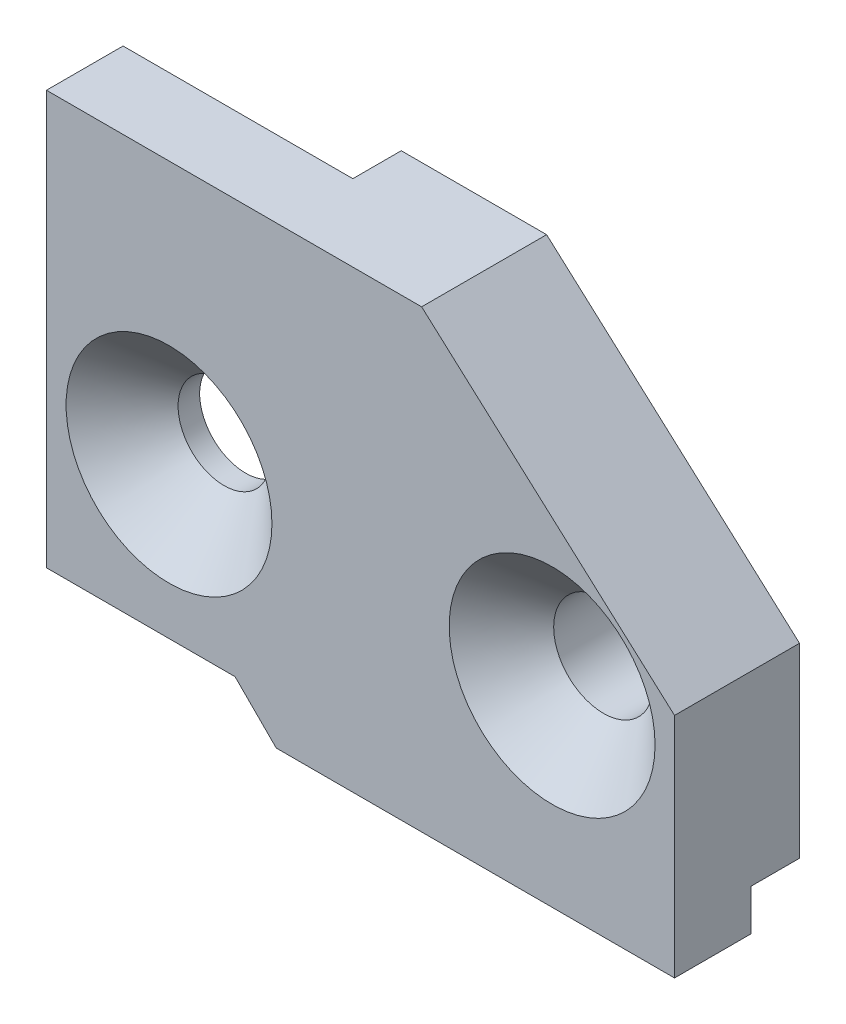
ISO-10303-21;
HEADER;
FILE_DESCRIPTION(('STEP AP214'),'2;1');
FILE_NAME('part.step','',(''),(''),'','','');
FILE_SCHEMA(('AUTOMOTIVE_DESIGN { 1 0 10303 214 1 1 1 1 }'));
ENDSEC;
DATA;
#1=APPLICATION_CONTEXT('core data for automotive mechanical design processes');
#2=APPLICATION_PROTOCOL_DEFINITION('international standard','automotive_design',2000,#1);
#3=PRODUCT_CONTEXT('',#1,'mechanical');
#4=PRODUCT('Part','Part','',(#3));
#5=PRODUCT_RELATED_PRODUCT_CATEGORY('part','',(#4));
#6=PRODUCT_DEFINITION_FORMATION('','',#4);
#7=PRODUCT_DEFINITION_CONTEXT('part definition',#1,'design');
#8=PRODUCT_DEFINITION('design','',#6,#7);
#9=PRODUCT_DEFINITION_SHAPE('','',#8);
#10=(LENGTH_UNIT() NAMED_UNIT(*) SI_UNIT(.MILLI.,.METRE.));
#11=(NAMED_UNIT(*) PLANE_ANGLE_UNIT() SI_UNIT($,.RADIAN.));
#12=(NAMED_UNIT(*) SI_UNIT($,.STERADIAN.) SOLID_ANGLE_UNIT());
#13=UNCERTAINTY_MEASURE_WITH_UNIT(LENGTH_MEASURE(1.E-05),#10,'distance_accuracy_value','');
#14=(GEOMETRIC_REPRESENTATION_CONTEXT(3) GLOBAL_UNCERTAINTY_ASSIGNED_CONTEXT((#13)) GLOBAL_UNIT_ASSIGNED_CONTEXT((#10,
#11,#12)) REPRESENTATION_CONTEXT('',''));
#15=CARTESIAN_POINT('',(0.,0.,0.));
#16=DIRECTION('',(0.,0.,1.));
#17=DIRECTION('',(1.,0.,0.));
#18=AXIS2_PLACEMENT_3D('',#15,#16,#17);
#19=CARTESIAN_POINT('',(0.,0.,0.));
#20=DIRECTION('',(0.,0.,1.));
#21=DIRECTION('',(1.,0.,0.));
#22=AXIS2_PLACEMENT_3D('',#19,#20,#21);
#23=PLANE('',#22);
#24=CARTESIAN_POINT('',(-92.232371,-75.223646,0.));
#25=DIRECTION('',(0.,0.,1.));
#26=DIRECTION('',(1.,0.,0.));
#27=AXIS2_PLACEMENT_3D('',#24,#25,#26);
#28=CIRCLE('',#27,1.5);
#29=CARTESIAN_POINT('',(-90.732371,-75.223646,0.));
#30=VERTEX_POINT('',#29);
#31=EDGE_CURVE('E158',#30,#30,#28,.T.);
#32=ORIENTED_EDGE('',*,*,#31,.T.);
#33=EDGE_LOOP('',(#32));
#34=FACE_BOUND('',#33,.T.);
#35=DIRECTION('',(0.,1.,0.));
#36=VECTOR('',#35,1.);
#37=CARTESIAN_POINT('',(-88.732371,-80.148646,0.));
#38=LINE('',#37,#36);
#39=CARTESIAN_POINT('',(-88.732371,-80.148646,0.));
#40=VERTEX_POINT('',#39);
#41=CARTESIAN_POINT('',(-88.732371,-66.648646,0.));
#42=VERTEX_POINT('',#41);
#43=EDGE_CURVE('E139',#40,#42,#38,.T.);
#44=ORIENTED_EDGE('',*,*,#43,.F.);
#45=DIRECTION('',(-1.,0.,0.));
#46=VECTOR('',#45,1.);
#47=CARTESIAN_POINT('',(-75.732371,-80.148646,0.));
#48=LINE('',#47,#46);
#49=CARTESIAN_POINT('',(-75.732371,-80.148646,0.));
#50=VERTEX_POINT('',#49);
#51=EDGE_CURVE('E50',#50,#40,#48,.T.);
#52=ORIENTED_EDGE('',*,*,#51,.F.);
#53=DIRECTION('',(0.,1.,0.));
#54=VECTOR('',#53,1.);
#55=CARTESIAN_POINT('',(-75.732371,-81.493646,0.));
#56=LINE('',#55,#54);
#57=CARTESIAN_POINT('',(-75.732371,-81.493646,0.));
#58=VERTEX_POINT('',#57);
#59=EDGE_CURVE('E185',#58,#50,#56,.T.);
#60=ORIENTED_EDGE('',*,*,#59,.F.);
#61=DIRECTION('',(1.,0.,0.));
#62=VECTOR('',#61,1.);
#63=CARTESIAN_POINT('',(-75.732371,-81.493646,0.));
#64=LINE('',#63,#62);
#65=CARTESIAN_POINT('',(-88.732371,-81.493646,0.));
#66=VERTEX_POINT('',#65);
#67=EDGE_CURVE('E183',#66,#58,#64,.T.);
#68=ORIENTED_EDGE('',*,*,#67,.F.);
#69=DIRECTION('',(0.707106781186551,-0.707106781186544,0.));
#70=VECTOR('',#69,1.);
#71=CARTESIAN_POINT('',(-90.077371,-80.148646,0.));
#72=LINE('',#71,#70);
#73=CARTESIAN_POINT('',(-90.077371,-80.148646,0.));
#74=VERTEX_POINT('',#73);
#75=EDGE_CURVE('E181',#74,#66,#72,.T.);
#76=ORIENTED_EDGE('',*,*,#75,.F.);
#77=DIRECTION('',(1.,0.,0.));
#78=VECTOR('',#77,1.);
#79=CARTESIAN_POINT('',(-96.232371,-80.148646,0.));
#80=LINE('',#79,#78);
#81=CARTESIAN_POINT('',(-96.232371,-80.148646,0.));
#82=VERTEX_POINT('',#81);
#83=EDGE_CURVE('E179',#82,#74,#80,.T.);
#84=ORIENTED_EDGE('',*,*,#83,.F.);
#85=DIRECTION('',(0.,-1.,0.));
#86=VECTOR('',#85,1.);
#87=CARTESIAN_POINT('',(-96.232371,-66.648646,0.));
#88=LINE('',#87,#86);
#89=CARTESIAN_POINT('',(-96.232371,-66.648646,0.));
#90=VERTEX_POINT('',#89);
#91=EDGE_CURVE('E161',#90,#82,#88,.T.);
#92=ORIENTED_EDGE('',*,*,#91,.F.);
#93=DIRECTION('',(-1.,0.,0.));
#94=VECTOR('',#93,1.);
#95=CARTESIAN_POINT('',(-96.232371,-66.648646,0.));
#96=LINE('',#95,#94);
#97=EDGE_CURVE('E56',#42,#90,#96,.T.);
#98=ORIENTED_EDGE('',*,*,#97,.F.);
#99=EDGE_LOOP('',(#44,#52,#60,#68,#76,#84,#92,#98));
#100=FACE_BOUND('',#99,.T.);
#101=ADVANCED_FACE('F33',(#34,#100),#23,.F.);
#102=CARTESIAN_POINT('',(0.,0.,2.5));
#103=DIRECTION('',(0.,0.,1.));
#104=DIRECTION('',(1.,0.,0.));
#105=AXIS2_PLACEMENT_3D('',#102,#103,#104);
#106=PLANE('',#105);
#107=CARTESIAN_POINT('',(-92.232371,-75.223646,2.5));
#108=DIRECTION('',(0.,0.,1.));
#109=DIRECTION('',(1.,0.,0.));
#110=AXIS2_PLACEMENT_3D('',#107,#108,#109);
#111=CIRCLE('',#110,3.35997123);
#112=CARTESIAN_POINT('',(-88.87239977,-75.223646,2.5));
#113=VERTEX_POINT('',#112);
#114=EDGE_CURVE('E199',#113,#113,#111,.T.);
#115=ORIENTED_EDGE('',*,*,#114,.F.);
#116=EDGE_LOOP('',(#115));
#117=FACE_BOUND('',#116,.T.);
#118=CARTESIAN_POINT('',(-79.72767153,-75.223646,2.5));
#119=DIRECTION('',(0.,0.,1.));
#120=DIRECTION('',(1.,0.,0.));
#121=AXIS2_PLACEMENT_3D('',#118,#119,#120);
#122=CIRCLE('',#121,3.35997123);
#123=CARTESIAN_POINT('',(-76.3677003,-75.223646,2.5));
#124=VERTEX_POINT('',#123);
#125=EDGE_CURVE('E204',#124,#124,#122,.T.);
#126=ORIENTED_EDGE('',*,*,#125,.F.);
#127=EDGE_LOOP('',(#126));
#128=FACE_BOUND('',#127,.T.);
#129=DIRECTION('',(0.,-1.,0.));
#130=VECTOR('',#129,1.);
#131=CARTESIAN_POINT('',(-96.232371,-66.648646,2.5));
#132=LINE('',#131,#130);
#133=CARTESIAN_POINT('',(-96.232371,-66.648646,2.5));
#134=VERTEX_POINT('',#133);
#135=CARTESIAN_POINT('',(-96.232371,-80.148646,2.5));
#136=VERTEX_POINT('',#135);
#137=EDGE_CURVE('E162',#134,#136,#132,.T.);
#138=ORIENTED_EDGE('',*,*,#137,.T.);
#139=DIRECTION('',(1.,0.,0.));
#140=VECTOR('',#139,1.);
#141=CARTESIAN_POINT('',(-96.232371,-80.148646,2.5));
#142=LINE('',#141,#140);
#143=CARTESIAN_POINT('',(-90.077371,-80.148646,2.5));
#144=VERTEX_POINT('',#143);
#145=EDGE_CURVE('E165',#136,#144,#142,.T.);
#146=ORIENTED_EDGE('',*,*,#145,.T.);
#147=DIRECTION('',(0.707106781186551,-0.707106781186544,0.));
#148=VECTOR('',#147,1.);
#149=CARTESIAN_POINT('',(-90.077371,-80.148646,2.5));
#150=LINE('',#149,#148);
#151=CARTESIAN_POINT('',(-88.732371,-81.493646,2.5));
#152=VERTEX_POINT('',#151);
#153=EDGE_CURVE('E167',#144,#152,#150,.T.);
#154=ORIENTED_EDGE('',*,*,#153,.T.);
#155=DIRECTION('',(1.,0.,0.));
#156=VECTOR('',#155,1.);
#157=CARTESIAN_POINT('',(-75.732371,-81.493646,2.5));
#158=LINE('',#157,#156);
#159=CARTESIAN_POINT('',(-75.732371,-81.493646,2.5));
#160=VERTEX_POINT('',#159);
#161=EDGE_CURVE('E169',#152,#160,#158,.T.);
#162=ORIENTED_EDGE('',*,*,#161,.T.);
#163=DIRECTION('',(0.,1.,0.));
#164=VECTOR('',#163,1.);
#165=CARTESIAN_POINT('',(-75.732371,-81.493646,2.5));
#166=LINE('',#165,#164);
#167=CARTESIAN_POINT('',(-75.732371,-74.071146,2.5));
#168=VERTEX_POINT('',#167);
#169=EDGE_CURVE('E171',#160,#168,#166,.T.);
#170=ORIENTED_EDGE('',*,*,#169,.T.);
#171=DIRECTION('',(-0.743595498868114,0.668629743627279,0.));
#172=VECTOR('',#171,1.);
#173=CARTESIAN_POINT('',(-75.732371,-74.071146,2.5));
#174=LINE('',#173,#172);
#175=CARTESIAN_POINT('',(-83.9870704700034,-66.648646,2.5));
#176=VERTEX_POINT('',#175);
#177=EDGE_CURVE('E119',#168,#176,#174,.T.);
#178=ORIENTED_EDGE('',*,*,#177,.T.);
#179=DIRECTION('',(-1.,0.,0.));
#180=VECTOR('',#179,1.);
#181=CARTESIAN_POINT('',(-83.9870704700034,-66.648646,2.5));
#182=LINE('',#181,#180);
#183=EDGE_CURVE('E174',#176,#134,#182,.T.);
#184=ORIENTED_EDGE('',*,*,#183,.T.);
#185=EDGE_LOOP('',(#138,#146,#154,#162,#170,#178,#184));
#186=FACE_BOUND('',#185,.T.);
#187=ADVANCED_FACE('F213',(#117,#128,#186),#106,.T.);
#188=CARTESIAN_POINT('',(-96.232371,-66.648646,2.5));
#189=DIRECTION('',(1.,0.,0.));
#190=DIRECTION('',(0.,0.,-1.));
#191=AXIS2_PLACEMENT_3D('',#188,#189,#190);
#192=PLANE('',#191);
#193=ORIENTED_EDGE('',*,*,#91,.T.);
#194=DIRECTION('',(0.,0.,-1.));
#195=VECTOR('',#194,1.);
#196=CARTESIAN_POINT('',(-96.232371,-80.148646,2.5));
#197=LINE('',#196,#195);
#198=EDGE_CURVE('E11',#136,#82,#197,.T.);
#199=ORIENTED_EDGE('',*,*,#198,.F.);
#200=ORIENTED_EDGE('',*,*,#137,.F.);
#201=DIRECTION('',(0.,0.,-1.));
#202=VECTOR('',#201,1.);
#203=CARTESIAN_POINT('',(-96.232371,-66.648646,2.5));
#204=LINE('',#203,#202);
#205=EDGE_CURVE('E176',#134,#90,#204,.T.);
#206=ORIENTED_EDGE('',*,*,#205,.T.);
#207=EDGE_LOOP('',(#193,#199,#200,#206));
#208=FACE_BOUND('',#207,.T.);
#209=ADVANCED_FACE('F35',(#208),#192,.F.);
#210=CARTESIAN_POINT('',(-96.232371,-80.148646,2.5));
#211=DIRECTION('',(0.,1.,0.));
#212=DIRECTION('',(0.,0.,1.));
#213=AXIS2_PLACEMENT_3D('',#210,#211,#212);
#214=PLANE('',#213);
#215=ORIENTED_EDGE('',*,*,#83,.T.);
#216=DIRECTION('',(0.,0.,-1.));
#217=VECTOR('',#216,1.);
#218=CARTESIAN_POINT('',(-90.077371,-80.148646,2.5));
#219=LINE('',#218,#217);
#220=EDGE_CURVE('E42',#144,#74,#219,.T.);
#221=ORIENTED_EDGE('',*,*,#220,.F.);
#222=ORIENTED_EDGE('',*,*,#145,.F.);
#223=ORIENTED_EDGE('',*,*,#198,.T.);
#224=EDGE_LOOP('',(#215,#221,#222,#223));
#225=FACE_BOUND('',#224,.T.);
#226=ADVANCED_FACE('F225',(#225),#214,.F.);
#227=CARTESIAN_POINT('',(-90.077371,-80.148646,2.5));
#228=DIRECTION('',(0.707106781186544,0.707106781186551,0.));
#229=DIRECTION('',(-0.707106781186551,0.707106781186544,0.));
#230=AXIS2_PLACEMENT_3D('',#227,#228,#229);
#231=PLANE('',#230);
#232=ORIENTED_EDGE('',*,*,#75,.T.);
#233=DIRECTION('',(0.,0.,-1.));
#234=VECTOR('',#233,1.);
#235=CARTESIAN_POINT('',(-88.732371,-81.493646,2.5));
#236=LINE('',#235,#234);
#237=EDGE_CURVE('E193',#152,#66,#236,.T.);
#238=ORIENTED_EDGE('',*,*,#237,.F.);
#239=ORIENTED_EDGE('',*,*,#153,.F.);
#240=ORIENTED_EDGE('',*,*,#220,.T.);
#241=EDGE_LOOP('',(#232,#238,#239,#240));
#242=FACE_BOUND('',#241,.T.);
#243=ADVANCED_FACE('F230',(#242),#231,.F.);
#244=CARTESIAN_POINT('',(-75.732371,-81.493646,2.5));
#245=DIRECTION('',(0.,1.,0.));
#246=DIRECTION('',(0.,0.,1.));
#247=AXIS2_PLACEMENT_3D('',#244,#245,#246);
#248=PLANE('',#247);
#249=ORIENTED_EDGE('',*,*,#67,.T.);
#250=DIRECTION('',(0.,0.,-1.));
#251=VECTOR('',#250,1.);
#252=CARTESIAN_POINT('',(-75.732371,-81.493646,2.5));
#253=LINE('',#252,#251);
#254=EDGE_CURVE('E122',#160,#58,#253,.T.);
#255=ORIENTED_EDGE('',*,*,#254,.F.);
#256=ORIENTED_EDGE('',*,*,#161,.F.);
#257=ORIENTED_EDGE('',*,*,#237,.T.);
#258=EDGE_LOOP('',(#249,#255,#256,#257));
#259=FACE_BOUND('',#258,.T.);
#260=ADVANCED_FACE('F234',(#259),#248,.F.);
#261=CARTESIAN_POINT('',(-75.732371,-81.493646,2.5));
#262=DIRECTION('',(-1.,0.,0.));
#263=DIRECTION('',(0.,0.,1.));
#264=AXIS2_PLACEMENT_3D('',#261,#262,#263);
#265=PLANE('',#264);
#266=ORIENTED_EDGE('',*,*,#59,.T.);
#267=DIRECTION('',(0.,0.,1.));
#268=VECTOR('',#267,1.);
#269=CARTESIAN_POINT('',(-75.732371,-80.148646,-1.58));
#270=LINE('',#269,#268);
#271=CARTESIAN_POINT('',(-75.732371,-80.148646,-1.58));
#272=VERTEX_POINT('',#271);
#273=EDGE_CURVE('E129',#272,#50,#270,.T.);
#274=ORIENTED_EDGE('',*,*,#273,.F.);
#275=DIRECTION('',(0.,-1.,0.));
#276=VECTOR('',#275,1.);
#277=CARTESIAN_POINT('',(-75.732371,-74.071146,-1.58));
#278=LINE('',#277,#276);
#279=CARTESIAN_POINT('',(-75.732371,-74.071146,-1.58));
#280=VERTEX_POINT('',#279);
#281=EDGE_CURVE('E126',#280,#272,#278,.T.);
#282=ORIENTED_EDGE('',*,*,#281,.F.);
#283=DIRECTION('',(0.,0.,-1.));
#284=VECTOR('',#283,1.);
#285=CARTESIAN_POINT('',(-75.732371,-74.071146,2.5));
#286=LINE('',#285,#284);
#287=EDGE_CURVE('E113',#168,#280,#286,.T.);
#288=ORIENTED_EDGE('',*,*,#287,.F.);
#289=ORIENTED_EDGE('',*,*,#169,.F.);
#290=ORIENTED_EDGE('',*,*,#254,.T.);
#291=EDGE_LOOP('',(#266,#274,#282,#288,#289,#290));
#292=FACE_BOUND('',#291,.T.);
#293=ADVANCED_FACE('F127',(#292),#265,.F.);
#294=CARTESIAN_POINT('',(-75.732371,-74.071146,2.5));
#295=DIRECTION('',(-0.668629743627279,-0.743595498868114,0.));
#296=DIRECTION('',(0.743595498868114,-0.668629743627278,0.));
#297=AXIS2_PLACEMENT_3D('',#294,#295,#296);
#298=PLANE('',#297);
#299=ORIENTED_EDGE('',*,*,#287,.T.);
#300=DIRECTION('',(0.743595498868114,-0.668629743627279,0.));
#301=VECTOR('',#300,1.);
#302=CARTESIAN_POINT('',(-83.9870704700034,-66.648646,-1.58));
#303=LINE('',#302,#301);
#304=CARTESIAN_POINT('',(-83.9870704700034,-66.648646,-1.58));
#305=VERTEX_POINT('',#304);
#306=EDGE_CURVE('E118',#305,#280,#303,.T.);
#307=ORIENTED_EDGE('',*,*,#306,.F.);
#308=DIRECTION('',(0.,0.,-1.));
#309=VECTOR('',#308,1.);
#310=CARTESIAN_POINT('',(-83.9870704700034,-66.648646,2.5));
#311=LINE('',#310,#309);
#312=EDGE_CURVE('E123',#176,#305,#311,.T.);
#313=ORIENTED_EDGE('',*,*,#312,.F.);
#314=ORIENTED_EDGE('',*,*,#177,.F.);
#315=EDGE_LOOP('',(#299,#307,#313,#314));
#316=FACE_BOUND('',#315,.T.);
#317=ADVANCED_FACE('F115',(#316),#298,.F.);
#318=CARTESIAN_POINT('',(-96.232371,-66.648646,2.5));
#319=DIRECTION('',(0.,-1.,0.));
#320=DIRECTION('',(0.,0.,-1.));
#321=AXIS2_PLACEMENT_3D('',#318,#319,#320);
#322=PLANE('',#321);
#323=ORIENTED_EDGE('',*,*,#312,.T.);
#324=DIRECTION('',(1.,0.,0.));
#325=VECTOR('',#324,1.);
#326=CARTESIAN_POINT('',(-88.732371,-66.648646,-1.58));
#327=LINE('',#326,#325);
#328=CARTESIAN_POINT('',(-88.732371,-66.648646,-1.58));
#329=VERTEX_POINT('',#328);
#330=EDGE_CURVE('E138',#329,#305,#327,.T.);
#331=ORIENTED_EDGE('',*,*,#330,.F.);
#332=DIRECTION('',(0.,0.,1.));
#333=VECTOR('',#332,1.);
#334=CARTESIAN_POINT('',(-88.732371,-66.648646,-1.58));
#335=LINE('',#334,#333);
#336=EDGE_CURVE('E150',#329,#42,#335,.T.);
#337=ORIENTED_EDGE('',*,*,#336,.T.);
#338=ORIENTED_EDGE('',*,*,#97,.T.);
#339=ORIENTED_EDGE('',*,*,#205,.F.);
#340=ORIENTED_EDGE('',*,*,#183,.F.);
#341=EDGE_LOOP('',(#323,#331,#337,#338,#339,#340));
#342=FACE_BOUND('',#341,.T.);
#343=ADVANCED_FACE('F243',(#342),#322,.F.);
#344=CARTESIAN_POINT('',(-92.232371,-75.223646,2.5));
#345=DIRECTION('',(0.,0.,-1.));
#346=DIRECTION('',(-1.,0.,0.));
#347=AXIS2_PLACEMENT_3D('',#344,#345,#346);
#348=CYLINDRICAL_SURFACE('',#347,1.5);
#349=CARTESIAN_POINT('',(-92.232371,-75.223646,0.703846661724897));
#350=DIRECTION('',(0.,0.,1.));
#351=DIRECTION('',(1.,0.,0.));
#352=AXIS2_PLACEMENT_3D('',#349,#350,#351);
#353=CIRCLE('',#352,1.5);
#354=CARTESIAN_POINT('',(-90.732371,-75.223646,0.703846661724897));
#355=VERTEX_POINT('',#354);
#356=EDGE_CURVE('E37',#355,#355,#353,.F.);
#357=ORIENTED_EDGE('',*,*,#356,.F.);
#358=EDGE_LOOP('',(#357));
#359=FACE_BOUND('',#358,.T.);
#360=ORIENTED_EDGE('',*,*,#31,.F.);
#361=EDGE_LOOP('',(#360));
#362=FACE_BOUND('',#361,.T.);
#363=ADVANCED_FACE('F246',(#359,#362),#348,.F.);
#364=CARTESIAN_POINT('',(-79.72767153,-75.223646,2.5));
#365=DIRECTION('',(0.,0.,-1.));
#366=DIRECTION('',(-1.,0.,0.));
#367=AXIS2_PLACEMENT_3D('',#364,#365,#366);
#368=CYLINDRICAL_SURFACE('',#367,1.625);
#369=CARTESIAN_POINT('',(-79.72767153,-75.223646,0.824557758575787));
#370=DIRECTION('',(0.,0.,1.));
#371=DIRECTION('',(1.,0.,0.));
#372=AXIS2_PLACEMENT_3D('',#369,#370,#371);
#373=CIRCLE('',#372,1.625);
#374=CARTESIAN_POINT('',(-78.10267153,-75.223646,0.824557758575787));
#375=VERTEX_POINT('',#374);
#376=EDGE_CURVE('E197',#375,#375,#373,.F.);
#377=ORIENTED_EDGE('',*,*,#376,.F.);
#378=EDGE_LOOP('',(#377));
#379=FACE_BOUND('',#378,.T.);
#380=CARTESIAN_POINT('',(-79.72767153,-75.223646,-1.58));
#381=DIRECTION('',(0.,0.,-1.));
#382=DIRECTION('',(-1.,0.,0.));
#383=AXIS2_PLACEMENT_3D('',#380,#381,#382);
#384=CIRCLE('',#383,1.625);
#385=CARTESIAN_POINT('',(-81.35267153,-75.223646,-1.58));
#386=VERTEX_POINT('',#385);
#387=EDGE_CURVE('E143',#386,#386,#384,.T.);
#388=ORIENTED_EDGE('',*,*,#387,.T.);
#389=EDGE_LOOP('',(#388));
#390=FACE_BOUND('',#389,.T.);
#391=ADVANCED_FACE('F280',(#379,#390),#368,.F.);
#392=CARTESIAN_POINT('',(0.,0.,-1.58));
#393=DIRECTION('',(0.,0.,-1.));
#394=DIRECTION('',(-1.,0.,0.));
#395=AXIS2_PLACEMENT_3D('',#392,#393,#394);
#396=PLANE('',#395);
#397=ORIENTED_EDGE('',*,*,#306,.T.);
#398=ORIENTED_EDGE('',*,*,#281,.T.);
#399=DIRECTION('',(-1.,0.,0.));
#400=VECTOR('',#399,1.);
#401=CARTESIAN_POINT('',(-75.732371,-80.148646,-1.58));
#402=LINE('',#401,#400);
#403=CARTESIAN_POINT('',(-88.732371,-80.148646,-1.58));
#404=VERTEX_POINT('',#403);
#405=EDGE_CURVE('E132',#272,#404,#402,.T.);
#406=ORIENTED_EDGE('',*,*,#405,.T.);
#407=DIRECTION('',(0.,1.,0.));
#408=VECTOR('',#407,1.);
#409=CARTESIAN_POINT('',(-88.732371,-80.148646,-1.58));
#410=LINE('',#409,#408);
#411=EDGE_CURVE('E147',#404,#329,#410,.T.);
#412=ORIENTED_EDGE('',*,*,#411,.T.);
#413=ORIENTED_EDGE('',*,*,#330,.T.);
#414=EDGE_LOOP('',(#397,#398,#406,#412,#413));
#415=FACE_BOUND('',#414,.T.);
#416=ORIENTED_EDGE('',*,*,#387,.F.);
#417=EDGE_LOOP('',(#416));
#418=FACE_BOUND('',#417,.T.);
#419=ADVANCED_FACE('F135',(#415,#418),#396,.T.);
#420=CARTESIAN_POINT('',(-75.732371,-80.148646,-1.58));
#421=DIRECTION('',(0.,1.,0.));
#422=DIRECTION('',(0.,0.,1.));
#423=AXIS2_PLACEMENT_3D('',#420,#421,#422);
#424=PLANE('',#423);
#425=ORIENTED_EDGE('',*,*,#51,.T.);
#426=DIRECTION('',(0.,0.,1.));
#427=VECTOR('',#426,1.);
#428=CARTESIAN_POINT('',(-88.732371,-80.148646,-1.58));
#429=LINE('',#428,#427);
#430=EDGE_CURVE('E154',#404,#40,#429,.T.);
#431=ORIENTED_EDGE('',*,*,#430,.F.);
#432=ORIENTED_EDGE('',*,*,#405,.F.);
#433=ORIENTED_EDGE('',*,*,#273,.T.);
#434=EDGE_LOOP('',(#425,#431,#432,#433));
#435=FACE_BOUND('',#434,.T.);
#436=ADVANCED_FACE('F318',(#435),#424,.F.);
#437=CARTESIAN_POINT('',(-88.732371,-80.148646,-1.58));
#438=DIRECTION('',(1.,0.,0.));
#439=DIRECTION('',(0.,0.,-1.));
#440=AXIS2_PLACEMENT_3D('',#437,#438,#439);
#441=PLANE('',#440);
#442=ORIENTED_EDGE('',*,*,#43,.T.);
#443=ORIENTED_EDGE('',*,*,#336,.F.);
#444=ORIENTED_EDGE('',*,*,#411,.F.);
#445=ORIENTED_EDGE('',*,*,#430,.T.);
#446=EDGE_LOOP('',(#442,#443,#444,#445));
#447=FACE_BOUND('',#446,.T.);
#448=ADVANCED_FACE('F271',(#447),#441,.F.);
#449=CARTESIAN_POINT('',(-79.72767153,-75.223646,2.5));
#450=DIRECTION('',(0.,0.,1.));
#451=DIRECTION('',(1.,0.,0.));
#452=AXIS2_PLACEMENT_3D('',#449,#450,#451);
#453=CONICAL_SURFACE('',#452,3.35997123,0.802851455917392);
#454=ORIENTED_EDGE('',*,*,#376,.T.);
#455=EDGE_LOOP('',(#454));
#456=FACE_BOUND('',#455,.T.);
#457=ORIENTED_EDGE('',*,*,#125,.T.);
#458=EDGE_LOOP('',(#457));
#459=FACE_BOUND('',#458,.T.);
#460=ADVANCED_FACE('F211',(#456,#459),#453,.F.);
#461=CARTESIAN_POINT('',(-92.232371,-75.223646,2.5));
#462=DIRECTION('',(0.,0.,1.));
#463=DIRECTION('',(1.,0.,0.));
#464=AXIS2_PLACEMENT_3D('',#461,#462,#463);
#465=CONICAL_SURFACE('',#464,3.35997123,0.802851455917392);
#466=ORIENTED_EDGE('',*,*,#356,.T.);
#467=EDGE_LOOP('',(#466));
#468=FACE_BOUND('',#467,.T.);
#469=ORIENTED_EDGE('',*,*,#114,.T.);
#470=EDGE_LOOP('',(#469));
#471=FACE_BOUND('',#470,.T.);
#472=ADVANCED_FACE('F303',(#468,#471),#465,.F.);
#473=CLOSED_SHELL('',(#101,#187,#209,#226,#243,#260,#293,#317,#343,#363,#391,#419,#436,#448,
#460,#472));
#474=MANIFOLD_SOLID_BREP('B2',#473);
#475=ADVANCED_BREP_SHAPE_REPRESENTATION('',(#18,#474),#14);
#476=SHAPE_DEFINITION_REPRESENTATION(#9,#475);
ENDSEC;
END-ISO-10303-21;
